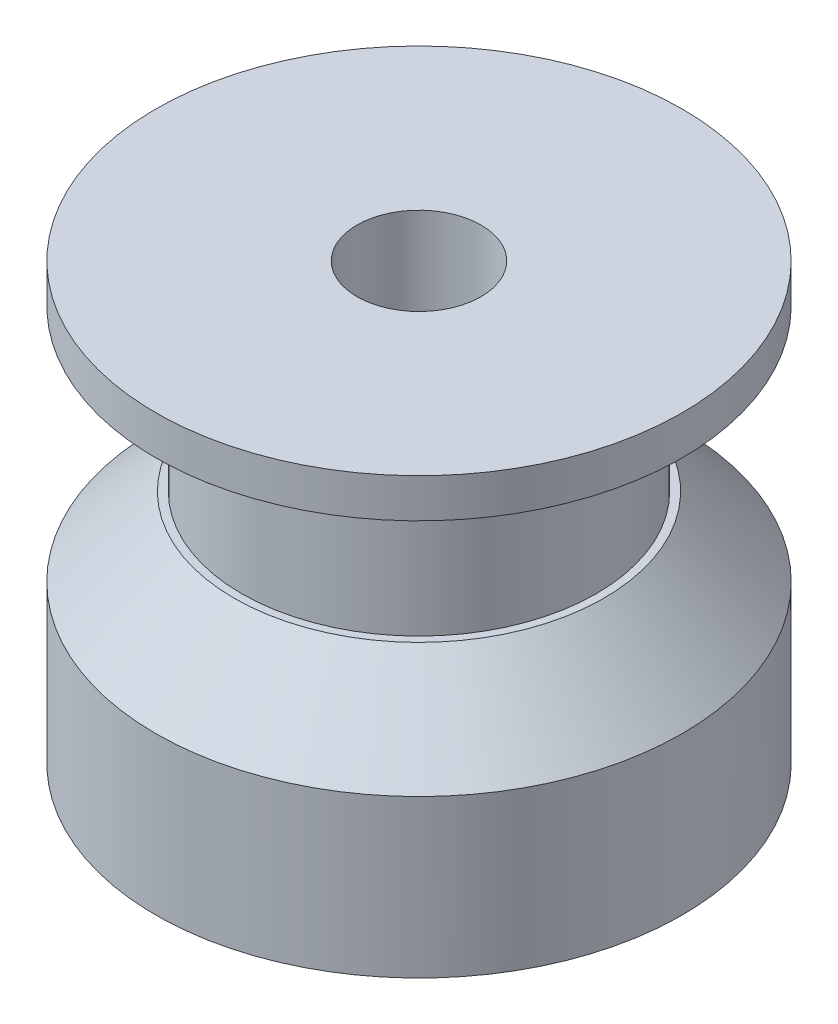
ISO-10303-21;
HEADER;
FILE_DESCRIPTION(('STEP AP214'),'2;1');
FILE_NAME('part.step','',(''),(''),'','','');
FILE_SCHEMA(('AUTOMOTIVE_DESIGN { 1 0 10303 214 1 1 1 1 }'));
ENDSEC;
DATA;
#1=APPLICATION_CONTEXT('core data for automotive mechanical design processes');
#2=APPLICATION_PROTOCOL_DEFINITION('international standard','automotive_design',2000,#1);
#3=PRODUCT_CONTEXT('',#1,'mechanical');
#4=PRODUCT('Part','Part','',(#3));
#5=PRODUCT_RELATED_PRODUCT_CATEGORY('part','',(#4));
#6=PRODUCT_DEFINITION_FORMATION('','',#4);
#7=PRODUCT_DEFINITION_CONTEXT('part definition',#1,'design');
#8=PRODUCT_DEFINITION('design','',#6,#7);
#9=PRODUCT_DEFINITION_SHAPE('','',#8);
#10=(LENGTH_UNIT() NAMED_UNIT(*) SI_UNIT(.MILLI.,.METRE.));
#11=(NAMED_UNIT(*) PLANE_ANGLE_UNIT() SI_UNIT($,.RADIAN.));
#12=(NAMED_UNIT(*) SI_UNIT($,.STERADIAN.) SOLID_ANGLE_UNIT());
#13=UNCERTAINTY_MEASURE_WITH_UNIT(LENGTH_MEASURE(1.E-05),#10,'distance_accuracy_value','');
#14=(GEOMETRIC_REPRESENTATION_CONTEXT(3) GLOBAL_UNCERTAINTY_ASSIGNED_CONTEXT((#13)) GLOBAL_UNIT_ASSIGNED_CONTEXT((#10,
#11,#12)) REPRESENTATION_CONTEXT('',''));
#15=CARTESIAN_POINT('',(0.,0.,0.));
#16=DIRECTION('',(0.,0.,1.));
#17=DIRECTION('',(1.,0.,0.));
#18=AXIS2_PLACEMENT_3D('',#15,#16,#17);
#19=CARTESIAN_POINT('',(6.731,0.,0.));
#20=DIRECTION('',(0.,-1.,0.));
#21=DIRECTION('',(0.,0.,-1.));
#22=AXIS2_PLACEMENT_3D('',#19,#20,#21);
#23=PLANE('',#22);
#24=CARTESIAN_POINT('',(0.,0.,4.97730052580181));
#25=DIRECTION('',(0.,-1.,0.));
#26=DIRECTION('',(0.,0.,-1.));
#27=AXIS2_PLACEMENT_3D('',#24,#25,#26);
#28=CIRCLE('',#27,0.79999999999999);
#29=CARTESIAN_POINT('',(0.,0.,4.17730052580182));
#30=VERTEX_POINT('',#29);
#31=EDGE_CURVE('E71',#30,#30,#28,.T.);
#32=ORIENTED_EDGE('',*,*,#31,.F.);
#33=EDGE_LOOP('',(#32));
#34=FACE_BOUND('',#33,.T.);
#35=CARTESIAN_POINT('',(4.97730052580181,0.,0.));
#36=DIRECTION('',(0.,-1.,0.));
#37=DIRECTION('',(0.,0.,-1.));
#38=AXIS2_PLACEMENT_3D('',#35,#36,#37);
#39=CIRCLE('',#38,0.79999999999999);
#40=CARTESIAN_POINT('',(4.97730052580181,0.,-0.800000000000007));
#41=VERTEX_POINT('',#40);
#42=EDGE_CURVE('E70',#41,#41,#39,.T.);
#43=ORIENTED_EDGE('',*,*,#42,.F.);
#44=EDGE_LOOP('',(#43));
#45=FACE_BOUND('',#44,.T.);
#46=CARTESIAN_POINT('',(0.,0.,-4.97730052580181));
#47=DIRECTION('',(0.,-1.,0.));
#48=DIRECTION('',(0.,0.,-1.));
#49=AXIS2_PLACEMENT_3D('',#46,#47,#48);
#50=CIRCLE('',#49,0.79999999999999);
#51=CARTESIAN_POINT('',(0.,0.,-5.7773005258018));
#52=VERTEX_POINT('',#51);
#53=EDGE_CURVE('E81',#52,#52,#50,.T.);
#54=ORIENTED_EDGE('',*,*,#53,.F.);
#55=EDGE_LOOP('',(#54));
#56=FACE_BOUND('',#55,.T.);
#57=CARTESIAN_POINT('',(-4.97730052580181,0.,0.));
#58=DIRECTION('',(0.,-1.,0.));
#59=DIRECTION('',(0.,0.,-1.));
#60=AXIS2_PLACEMENT_3D('',#57,#58,#59);
#61=CIRCLE('',#60,0.79999999999999);
#62=CARTESIAN_POINT('',(-4.97730052580181,0.,-0.799999999999938));
#63=VERTEX_POINT('',#62);
#64=EDGE_CURVE('E87',#63,#63,#61,.T.);
#65=ORIENTED_EDGE('',*,*,#64,.F.);
#66=EDGE_LOOP('',(#65));
#67=FACE_BOUND('',#66,.T.);
#68=CARTESIAN_POINT('',(0.,0.,0.));
#69=DIRECTION('',(0.,-1.,0.));
#70=DIRECTION('',(0.,0.,-1.));
#71=AXIS2_PLACEMENT_3D('',#68,#69,#70);
#72=CIRCLE('',#71,6.731);
#73=CARTESIAN_POINT('',(0.,0.,-6.731));
#74=VERTEX_POINT('',#73);
#75=EDGE_CURVE('E93',#74,#74,#72,.T.);
#76=ORIENTED_EDGE('',*,*,#75,.T.);
#77=EDGE_LOOP('',(#76));
#78=FACE_BOUND('',#77,.T.);
#79=CARTESIAN_POINT('',(0.,0.,0.));
#80=DIRECTION('',(0.,-1.,0.));
#81=DIRECTION('',(0.,0.,-1.));
#82=AXIS2_PLACEMENT_3D('',#79,#80,#81);
#83=CIRCLE('',#82,1.5875);
#84=CARTESIAN_POINT('',(0.,0.,-1.5875));
#85=VERTEX_POINT('',#84);
#86=EDGE_CURVE('E111',#85,#85,#83,.T.);
#87=ORIENTED_EDGE('',*,*,#86,.F.);
#88=EDGE_LOOP('',(#87));
#89=FACE_BOUND('',#88,.T.);
#90=ADVANCED_FACE('F39',(#34,#45,#56,#67,#78,#89),#23,.T.);
#91=CARTESIAN_POINT('',(0.,0.,0.));
#92=DIRECTION('',(0.,-1.,0.));
#93=DIRECTION('',(0.,0.,-1.));
#94=AXIS2_PLACEMENT_3D('',#91,#92,#93);
#95=CYLINDRICAL_SURFACE('',#94,1.5875);
#96=ORIENTED_EDGE('',*,*,#86,.T.);
#97=EDGE_LOOP('',(#96));
#98=FACE_BOUND('',#97,.T.);
#99=CARTESIAN_POINT('',(0.,11.1252,0.));
#100=DIRECTION('',(0.,-1.,0.));
#101=DIRECTION('',(0.,0.,-1.));
#102=AXIS2_PLACEMENT_3D('',#99,#100,#101);
#103=CIRCLE('',#102,1.5875);
#104=CARTESIAN_POINT('',(0.,11.1252,-1.5875));
#105=VERTEX_POINT('',#104);
#106=EDGE_CURVE('E108',#105,#105,#103,.T.);
#107=ORIENTED_EDGE('',*,*,#106,.F.);
#108=EDGE_LOOP('',(#107));
#109=FACE_BOUND('',#108,.T.);
#110=ADVANCED_FACE('F132',(#98,#109),#95,.F.);
#111=CARTESIAN_POINT('',(1.5875,11.1252,0.));
#112=DIRECTION('',(0.,1.,0.));
#113=DIRECTION('',(0.,0.,1.));
#114=AXIS2_PLACEMENT_3D('',#111,#112,#113);
#115=PLANE('',#114);
#116=ORIENTED_EDGE('',*,*,#106,.T.);
#117=EDGE_LOOP('',(#116));
#118=FACE_BOUND('',#117,.T.);
#119=CARTESIAN_POINT('',(0.,11.1252,0.));
#120=DIRECTION('',(0.,-1.,0.));
#121=DIRECTION('',(0.,0.,-1.));
#122=AXIS2_PLACEMENT_3D('',#119,#120,#121);
#123=CIRCLE('',#122,6.73);
#124=CARTESIAN_POINT('',(0.,11.1252,-6.73));
#125=VERTEX_POINT('',#124);
#126=EDGE_CURVE('E105',#125,#125,#123,.T.);
#127=ORIENTED_EDGE('',*,*,#126,.F.);
#128=EDGE_LOOP('',(#127));
#129=FACE_BOUND('',#128,.T.);
#130=ADVANCED_FACE('F137',(#118,#129),#115,.T.);
#131=CARTESIAN_POINT('',(0.,0.,0.));
#132=DIRECTION('',(0.,-1.,0.));
#133=DIRECTION('',(0.,0.,-1.));
#134=AXIS2_PLACEMENT_3D('',#131,#132,#133);
#135=CYLINDRICAL_SURFACE('',#134,6.73);
#136=ORIENTED_EDGE('',*,*,#126,.T.);
#137=EDGE_LOOP('',(#136));
#138=FACE_BOUND('',#137,.T.);
#139=CARTESIAN_POINT('',(0.,10.1252,0.));
#140=DIRECTION('',(0.,-1.,0.));
#141=DIRECTION('',(0.,0.,-1.));
#142=AXIS2_PLACEMENT_3D('',#139,#140,#141);
#143=CIRCLE('',#142,6.73);
#144=CARTESIAN_POINT('',(0.,10.1252,-6.73));
#145=VERTEX_POINT('',#144);
#146=EDGE_CURVE('E102',#145,#145,#143,.T.);
#147=ORIENTED_EDGE('',*,*,#146,.F.);
#148=EDGE_LOOP('',(#147));
#149=FACE_BOUND('',#148,.T.);
#150=ADVANCED_FACE('F145',(#138,#149),#135,.T.);
#151=CARTESIAN_POINT('',(6.73,10.1252,0.));
#152=DIRECTION('',(0.,-1.,0.));
#153=DIRECTION('',(0.,0.,-1.));
#154=AXIS2_PLACEMENT_3D('',#151,#152,#153);
#155=PLANE('',#154);
#156=ORIENTED_EDGE('',*,*,#146,.T.);
#157=EDGE_LOOP('',(#156));
#158=FACE_BOUND('',#157,.T.);
#159=CARTESIAN_POINT('',(0.,10.1252,0.));
#160=DIRECTION('',(0.,-1.,0.));
#161=DIRECTION('',(0.,0.,-1.));
#162=AXIS2_PLACEMENT_3D('',#159,#160,#161);
#163=CIRCLE('',#162,4.5339);
#164=CARTESIAN_POINT('',(0.,10.1252,-4.5339));
#165=VERTEX_POINT('',#164);
#166=EDGE_CURVE('E99',#165,#165,#163,.T.);
#167=ORIENTED_EDGE('',*,*,#166,.F.);
#168=EDGE_LOOP('',(#167));
#169=FACE_BOUND('',#168,.T.);
#170=ADVANCED_FACE('F149',(#158,#169),#155,.T.);
#171=CARTESIAN_POINT('',(0.,0.,0.));
#172=DIRECTION('',(0.,-1.,0.));
#173=DIRECTION('',(0.,0.,-1.));
#174=AXIS2_PLACEMENT_3D('',#171,#172,#173);
#175=CYLINDRICAL_SURFACE('',#174,4.5339);
#176=ORIENTED_EDGE('',*,*,#166,.T.);
#177=EDGE_LOOP('',(#176));
#178=FACE_BOUND('',#177,.T.);
#179=CARTESIAN_POINT('',(0.,6.01980009793552,0.));
#180=DIRECTION('',(0.,-1.,0.));
#181=DIRECTION('',(0.,0.,-1.));
#182=AXIS2_PLACEMENT_3D('',#179,#180,#181);
#183=CIRCLE('',#182,4.5339);
#184=CARTESIAN_POINT('',(0.,6.01980009793552,-4.5339));
#185=VERTEX_POINT('',#184);
#186=EDGE_CURVE('E96',#185,#185,#183,.T.);
#187=ORIENTED_EDGE('',*,*,#186,.F.);
#188=EDGE_LOOP('',(#187));
#189=FACE_BOUND('',#188,.T.);
#190=ADVANCED_FACE('F153',(#178,#189),#175,.T.);
#191=CARTESIAN_POINT('',(4.5339,6.01980009793552,0.));
#192=DIRECTION('',(0.,1.,0.));
#193=DIRECTION('',(0.,0.,1.));
#194=AXIS2_PLACEMENT_3D('',#191,#192,#193);
#195=PLANE('',#194);
#196=CARTESIAN_POINT('',(0.,6.01980009793552,0.));
#197=DIRECTION('',(0.,1.,0.));
#198=DIRECTION('',(0.,0.,1.));
#199=AXIS2_PLACEMENT_3D('',#196,#197,#198);
#200=CIRCLE('',#199,4.73099999999999);
#201=CARTESIAN_POINT('',(0.,6.01980009793552,4.73099999999999));
#202=VERTEX_POINT('',#201);
#203=EDGE_CURVE('E11',#202,#202,#200,.T.);
#204=ORIENTED_EDGE('',*,*,#203,.T.);
#205=EDGE_LOOP('',(#204));
#206=FACE_BOUND('',#205,.T.);
#207=ORIENTED_EDGE('',*,*,#186,.T.);
#208=EDGE_LOOP('',(#207));
#209=FACE_BOUND('',#208,.T.);
#210=ADVANCED_FACE('F128',(#206,#209),#195,.T.);
#211=CARTESIAN_POINT('',(0.,0.,0.));
#212=DIRECTION('',(0.,-1.,0.));
#213=DIRECTION('',(0.,0.,-1.));
#214=AXIS2_PLACEMENT_3D('',#211,#212,#213);
#215=CYLINDRICAL_SURFACE('',#214,6.731);
#216=CARTESIAN_POINT('',(0.,4.01980009793552,0.));
#217=DIRECTION('',(0.,1.,0.));
#218=DIRECTION('',(0.,0.,1.));
#219=AXIS2_PLACEMENT_3D('',#216,#217,#218);
#220=CIRCLE('',#219,6.731);
#221=CARTESIAN_POINT('',(0.,4.01980009793552,6.731));
#222=VERTEX_POINT('',#221);
#223=EDGE_CURVE('E47',#222,#222,#220,.F.);
#224=ORIENTED_EDGE('',*,*,#223,.T.);
#225=EDGE_LOOP('',(#224));
#226=FACE_BOUND('',#225,.T.);
#227=ORIENTED_EDGE('',*,*,#75,.F.);
#228=EDGE_LOOP('',(#227));
#229=FACE_BOUND('',#228,.T.);
#230=ADVANCED_FACE('F116',(#226,#229),#215,.T.);
#231=CARTESIAN_POINT('',(0.,4.01980009793552,0.));
#232=DIRECTION('',(0.,-1.,0.));
#233=DIRECTION('',(0.,0.,-1.));
#234=AXIS2_PLACEMENT_3D('',#231,#232,#233);
#235=CONICAL_SURFACE('',#234,6.731,0.78539816339745);
#236=ORIENTED_EDGE('',*,*,#203,.F.);
#237=EDGE_LOOP('',(#236));
#238=FACE_BOUND('',#237,.T.);
#239=ORIENTED_EDGE('',*,*,#223,.F.);
#240=EDGE_LOOP('',(#239));
#241=FACE_BOUND('',#240,.T.);
#242=ADVANCED_FACE('F41',(#238,#241),#235,.T.);
#243=CARTESIAN_POINT('',(-4.97730052580181,3.,0.));
#244=DIRECTION('',(0.,-1.,0.));
#245=DIRECTION('',(0.,0.,-1.));
#246=AXIS2_PLACEMENT_3D('',#243,#244,#245);
#247=CONICAL_SURFACE('',#246,0.799999999999999,1.02974425867665);
#248=CARTESIAN_POINT('',(-4.97730052580181,3.48068849522205,0.));
#249=VERTEX_POINT('',#248);
#250=VERTEX_LOOP('',#249);
#251=FACE_BOUND('',#250,.T.);
#252=CARTESIAN_POINT('',(-4.97730052580181,3.,0.));
#253=DIRECTION('',(0.,-1.,0.));
#254=DIRECTION('',(0.,0.,-1.));
#255=AXIS2_PLACEMENT_3D('',#252,#253,#254);
#256=CIRCLE('',#255,0.799999999999999);
#257=CARTESIAN_POINT('',(-4.97730052580181,3.,-0.799999999999947));
#258=VERTEX_POINT('',#257);
#259=EDGE_CURVE('E90',#258,#258,#256,.T.);
#260=ORIENTED_EDGE('',*,*,#259,.T.);
#261=EDGE_LOOP('',(#260));
#262=FACE_BOUND('',#261,.T.);
#263=ADVANCED_FACE('F120',(#251,#262),#247,.F.);
#264=CARTESIAN_POINT('',(-4.97730052580181,0.,0.));
#265=DIRECTION('',(0.,-1.,0.));
#266=DIRECTION('',(0.,0.,-1.));
#267=AXIS2_PLACEMENT_3D('',#264,#265,#266);
#268=CYLINDRICAL_SURFACE('',#267,0.799999999999994);
#269=ORIENTED_EDGE('',*,*,#259,.F.);
#270=EDGE_LOOP('',(#269));
#271=FACE_BOUND('',#270,.T.);
#272=ORIENTED_EDGE('',*,*,#64,.T.);
#273=EDGE_LOOP('',(#272));
#274=FACE_BOUND('',#273,.T.);
#275=ADVANCED_FACE('F126',(#271,#274),#268,.F.);
#276=CARTESIAN_POINT('',(0.,3.,-4.97730052580181));
#277=DIRECTION('',(0.,-1.,0.));
#278=DIRECTION('',(0.,0.,-1.));
#279=AXIS2_PLACEMENT_3D('',#276,#277,#278);
#280=CONICAL_SURFACE('',#279,0.799999999999999,1.02974425867665);
#281=CARTESIAN_POINT('',(0.,3.48068849522205,-4.97730052580181));
#282=VERTEX_POINT('',#281);
#283=VERTEX_LOOP('',#282);
#284=FACE_BOUND('',#283,.T.);
#285=CARTESIAN_POINT('',(0.,3.,-4.97730052580181));
#286=DIRECTION('',(0.,-1.,0.));
#287=DIRECTION('',(0.,0.,-1.));
#288=AXIS2_PLACEMENT_3D('',#285,#286,#287);
#289=CIRCLE('',#288,0.799999999999999);
#290=CARTESIAN_POINT('',(0.,3.,-5.77730052580181));
#291=VERTEX_POINT('',#290);
#292=EDGE_CURVE('E84',#291,#291,#289,.T.);
#293=ORIENTED_EDGE('',*,*,#292,.T.);
#294=EDGE_LOOP('',(#293));
#295=FACE_BOUND('',#294,.T.);
#296=ADVANCED_FACE('F163',(#284,#295),#280,.F.);
#297=CARTESIAN_POINT('',(0.,0.,-4.97730052580181));
#298=DIRECTION('',(0.,-1.,0.));
#299=DIRECTION('',(0.,0.,-1.));
#300=AXIS2_PLACEMENT_3D('',#297,#298,#299);
#301=CYLINDRICAL_SURFACE('',#300,0.799999999999994);
#302=ORIENTED_EDGE('',*,*,#292,.F.);
#303=EDGE_LOOP('',(#302));
#304=FACE_BOUND('',#303,.T.);
#305=ORIENTED_EDGE('',*,*,#53,.T.);
#306=EDGE_LOOP('',(#305));
#307=FACE_BOUND('',#306,.T.);
#308=ADVANCED_FACE('F167',(#304,#307),#301,.F.);
#309=CARTESIAN_POINT('',(4.97730052580181,3.,0.));
#310=DIRECTION('',(0.,-1.,0.));
#311=DIRECTION('',(0.,0.,-1.));
#312=AXIS2_PLACEMENT_3D('',#309,#310,#311);
#313=CONICAL_SURFACE('',#312,0.799999999999999,1.02974425867665);
#314=CARTESIAN_POINT('',(4.97730052580181,3.48068849522205,0.));
#315=VERTEX_POINT('',#314);
#316=VERTEX_LOOP('',#315);
#317=FACE_BOUND('',#316,.T.);
#318=CARTESIAN_POINT('',(4.97730052580181,3.,0.));
#319=DIRECTION('',(0.,-1.,0.));
#320=DIRECTION('',(0.,0.,-1.));
#321=AXIS2_PLACEMENT_3D('',#318,#319,#320);
#322=CIRCLE('',#321,0.799999999999999);
#323=CARTESIAN_POINT('',(4.97730052580181,3.,-0.800000000000016));
#324=VERTEX_POINT('',#323);
#325=EDGE_CURVE('E74',#324,#324,#322,.T.);
#326=ORIENTED_EDGE('',*,*,#325,.T.);
#327=EDGE_LOOP('',(#326));
#328=FACE_BOUND('',#327,.T.);
#329=ADVANCED_FACE('F170',(#317,#328),#313,.F.);
#330=CARTESIAN_POINT('',(4.97730052580181,0.,0.));
#331=DIRECTION('',(0.,-1.,0.));
#332=DIRECTION('',(0.,0.,-1.));
#333=AXIS2_PLACEMENT_3D('',#330,#331,#332);
#334=CYLINDRICAL_SURFACE('',#333,0.799999999999994);
#335=ORIENTED_EDGE('',*,*,#325,.F.);
#336=EDGE_LOOP('',(#335));
#337=FACE_BOUND('',#336,.T.);
#338=ORIENTED_EDGE('',*,*,#42,.T.);
#339=EDGE_LOOP('',(#338));
#340=FACE_BOUND('',#339,.T.);
#341=ADVANCED_FACE('F64',(#337,#340),#334,.F.);
#342=CARTESIAN_POINT('',(0.,3.,4.97730052580181));
#343=DIRECTION('',(0.,-1.,0.));
#344=DIRECTION('',(0.,0.,-1.));
#345=AXIS2_PLACEMENT_3D('',#342,#343,#344);
#346=CONICAL_SURFACE('',#345,0.799999999999999,1.02974425867665);
#347=CARTESIAN_POINT('',(0.,3.48068849522205,4.97730052580181));
#348=VERTEX_POINT('',#347);
#349=VERTEX_LOOP('',#348);
#350=FACE_BOUND('',#349,.T.);
#351=CARTESIAN_POINT('',(0.,3.,4.97730052580181));
#352=DIRECTION('',(0.,-1.,0.));
#353=DIRECTION('',(0.,0.,-1.));
#354=AXIS2_PLACEMENT_3D('',#351,#352,#353);
#355=CIRCLE('',#354,0.799999999999999);
#356=CARTESIAN_POINT('',(0.,3.,4.17730052580181));
#357=VERTEX_POINT('',#356);
#358=EDGE_CURVE('E68',#357,#357,#355,.T.);
#359=ORIENTED_EDGE('',*,*,#358,.T.);
#360=EDGE_LOOP('',(#359));
#361=FACE_BOUND('',#360,.T.);
#362=ADVANCED_FACE('F60',(#350,#361),#346,.F.);
#363=CARTESIAN_POINT('',(0.,0.,4.97730052580181));
#364=DIRECTION('',(0.,-1.,0.));
#365=DIRECTION('',(0.,0.,-1.));
#366=AXIS2_PLACEMENT_3D('',#363,#364,#365);
#367=CYLINDRICAL_SURFACE('',#366,0.799999999999994);
#368=ORIENTED_EDGE('',*,*,#358,.F.);
#369=EDGE_LOOP('',(#368));
#370=FACE_BOUND('',#369,.T.);
#371=ORIENTED_EDGE('',*,*,#31,.T.);
#372=EDGE_LOOP('',(#371));
#373=FACE_BOUND('',#372,.T.);
#374=ADVANCED_FACE('F63',(#370,#373),#367,.F.);
#375=CLOSED_SHELL('',(#90,#110,#130,#150,#170,#190,#210,#230,#242,#263,#275,#296,#308,#329,#341,
#362,#374));
#376=MANIFOLD_SOLID_BREP('B2',#375);
#377=ADVANCED_BREP_SHAPE_REPRESENTATION('',(#18,#376),#14);
#378=SHAPE_DEFINITION_REPRESENTATION(#9,#377);
ENDSEC;
END-ISO-10303-21;
